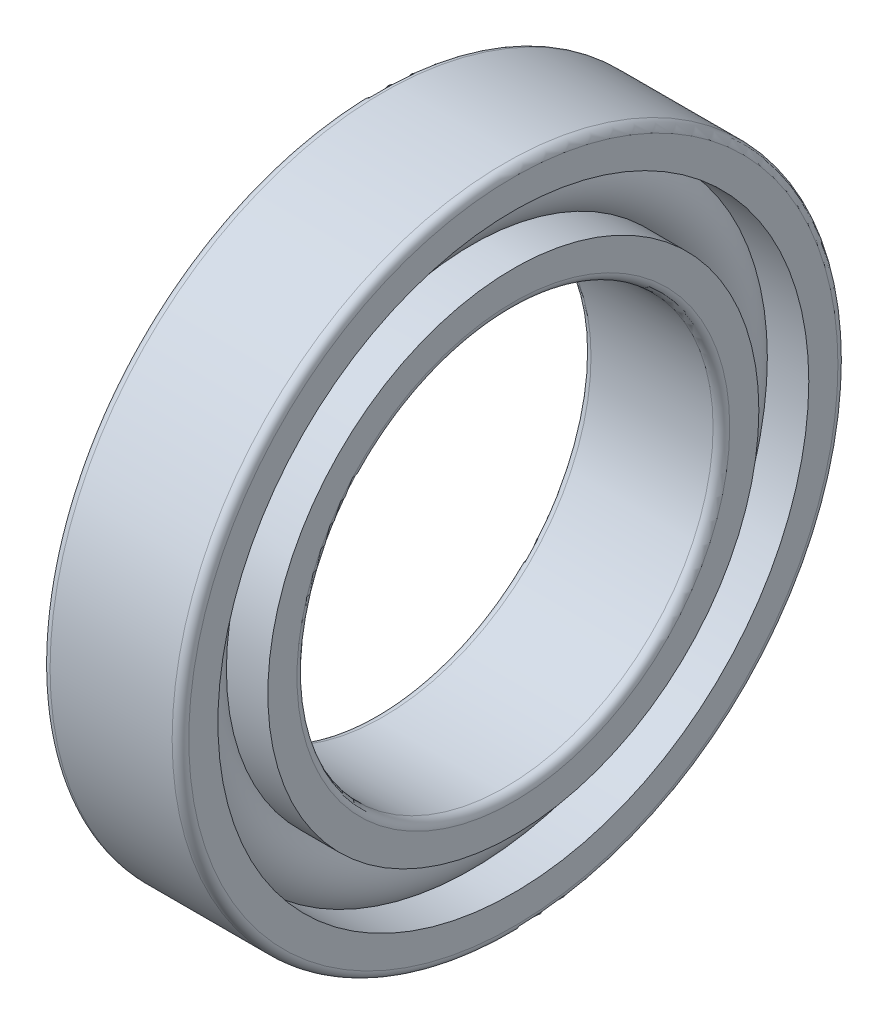
ISO-10303-21;
HEADER;
FILE_DESCRIPTION(('STEP AP214'),'2;1');
FILE_NAME('part.step','',(''),(''),'','','');
FILE_SCHEMA(('AUTOMOTIVE_DESIGN { 1 0 10303 214 1 1 1 1 }'));
ENDSEC;
DATA;
#1=APPLICATION_CONTEXT('core data for automotive mechanical design processes');
#2=APPLICATION_PROTOCOL_DEFINITION('international standard','automotive_design',2000,#1);
#3=PRODUCT_CONTEXT('',#1,'mechanical');
#4=PRODUCT('Part','Part','',(#3));
#5=PRODUCT_RELATED_PRODUCT_CATEGORY('part','',(#4));
#6=PRODUCT_DEFINITION_FORMATION('','',#4);
#7=PRODUCT_DEFINITION_CONTEXT('part definition',#1,'design');
#8=PRODUCT_DEFINITION('design','',#6,#7);
#9=PRODUCT_DEFINITION_SHAPE('','',#8);
#10=(LENGTH_UNIT() NAMED_UNIT(*) SI_UNIT(.MILLI.,.METRE.));
#11=(NAMED_UNIT(*) PLANE_ANGLE_UNIT() SI_UNIT($,.RADIAN.));
#12=(NAMED_UNIT(*) SI_UNIT($,.STERADIAN.) SOLID_ANGLE_UNIT());
#13=UNCERTAINTY_MEASURE_WITH_UNIT(LENGTH_MEASURE(1.E-05),#10,'distance_accuracy_value','');
#14=(GEOMETRIC_REPRESENTATION_CONTEXT(3) GLOBAL_UNCERTAINTY_ASSIGNED_CONTEXT((#13)) GLOBAL_UNIT_ASSIGNED_CONTEXT((#10,
#11,#12)) REPRESENTATION_CONTEXT('',''));
#15=CARTESIAN_POINT('',(0.,0.,0.));
#16=DIRECTION('',(0.,0.,1.));
#17=DIRECTION('',(1.,0.,0.));
#18=AXIS2_PLACEMENT_3D('',#15,#16,#17);
#19=CARTESIAN_POINT('',(0.,0.,0.));
#20=DIRECTION('',(-1.,0.,0.));
#21=DIRECTION('',(0.,0.,1.));
#22=AXIS2_PLACEMENT_3D('',#19,#20,#21);
#23=TOROIDAL_SURFACE('',#22,9.75,1.35);
#24=CARTESIAN_POINT('',(1.0062305898749,0.,0.));
#25=DIRECTION('',(-1.,0.,0.));
#26=DIRECTION('',(0.,0.,1.));
#27=AXIS2_PLACEMENT_3D('',#24,#25,#26);
#28=CIRCLE('',#27,10.65);
#29=CARTESIAN_POINT('',(1.0062305898749,0.,10.65));
#30=VERTEX_POINT('',#29);
#31=EDGE_CURVE('E34',#30,#30,#28,.F.);
#32=ORIENTED_EDGE('',*,*,#31,.T.);
#33=EDGE_LOOP('',(#32));
#34=FACE_BOUND('',#33,.T.);
#35=CARTESIAN_POINT('',(1.00623058987491,0.,0.));
#36=DIRECTION('',(-1.,0.,0.));
#37=DIRECTION('',(0.,0.,1.));
#38=AXIS2_PLACEMENT_3D('',#35,#36,#37);
#39=CIRCLE('',#38,8.85);
#40=CARTESIAN_POINT('',(1.00623058987491,0.,8.85));
#41=VERTEX_POINT('',#40);
#42=EDGE_CURVE('E10',#41,#41,#39,.T.);
#43=ORIENTED_EDGE('',*,*,#42,.T.);
#44=EDGE_LOOP('',(#43));
#45=FACE_BOUND('',#44,.T.);
#46=ADVANCED_FACE('F30',(#34,#45),#23,.T.);
#47=CARTESIAN_POINT('',(-20.6375,0.,0.));
#48=DIRECTION('',(1.,0.,0.));
#49=DIRECTION('',(0.,0.,-1.));
#50=AXIS2_PLACEMENT_3D('',#47,#48,#49);
#51=CYLINDRICAL_SURFACE('',#50,8.85);
#52=CARTESIAN_POINT('',(2.5,0.,0.));
#53=DIRECTION('',(1.,0.,0.));
#54=DIRECTION('',(0.,0.,-1.));
#55=AXIS2_PLACEMENT_3D('',#52,#53,#54);
#56=CIRCLE('',#55,8.85);
#57=CARTESIAN_POINT('',(2.5,0.,-8.85));
#58=VERTEX_POINT('',#57);
#59=EDGE_CURVE('E43',#58,#58,#56,.T.);
#60=ORIENTED_EDGE('',*,*,#59,.F.);
#61=EDGE_LOOP('',(#60));
#62=FACE_BOUND('',#61,.T.);
#63=ORIENTED_EDGE('',*,*,#42,.F.);
#64=EDGE_LOOP('',(#63));
#65=FACE_BOUND('',#64,.T.);
#66=ADVANCED_FACE('F82',(#62,#65),#51,.T.);
#67=CARTESIAN_POINT('',(-20.6375,0.,0.));
#68=DIRECTION('',(1.,0.,0.));
#69=DIRECTION('',(0.,0.,-1.));
#70=AXIS2_PLACEMENT_3D('',#67,#68,#69);
#71=CYLINDRICAL_SURFACE('',#70,8.85);
#72=CARTESIAN_POINT('',(-2.5,0.,0.));
#73=DIRECTION('',(1.,0.,0.));
#74=DIRECTION('',(0.,0.,-1.));
#75=AXIS2_PLACEMENT_3D('',#72,#73,#74);
#76=CIRCLE('',#75,8.85);
#77=CARTESIAN_POINT('',(-2.5,0.,-8.85));
#78=VERTEX_POINT('',#77);
#79=EDGE_CURVE('E52',#78,#78,#76,.T.);
#80=ORIENTED_EDGE('',*,*,#79,.T.);
#81=EDGE_LOOP('',(#80));
#82=FACE_BOUND('',#81,.T.);
#83=CARTESIAN_POINT('',(-1.00623058987491,0.,0.));
#84=DIRECTION('',(1.,0.,0.));
#85=DIRECTION('',(0.,0.,-1.));
#86=AXIS2_PLACEMENT_3D('',#83,#84,#85);
#87=CIRCLE('',#86,8.85);
#88=CARTESIAN_POINT('',(-1.00623058987491,0.,-8.85));
#89=VERTEX_POINT('',#88);
#90=EDGE_CURVE('E38',#89,#89,#87,.T.);
#91=ORIENTED_EDGE('',*,*,#90,.F.);
#92=EDGE_LOOP('',(#91));
#93=FACE_BOUND('',#92,.T.);
#94=ADVANCED_FACE('F85',(#82,#93),#71,.T.);
#95=CARTESIAN_POINT('',(2.5,7.8,0.));
#96=DIRECTION('',(1.,0.,0.));
#97=DIRECTION('',(0.,0.,-1.));
#98=AXIS2_PLACEMENT_3D('',#95,#96,#97);
#99=PLANE('',#98);
#100=ORIENTED_EDGE('',*,*,#59,.T.);
#101=EDGE_LOOP('',(#100));
#102=FACE_BOUND('',#101,.T.);
#103=CARTESIAN_POINT('',(2.5,0.,0.));
#104=DIRECTION('',(1.,0.,0.));
#105=DIRECTION('',(0.,0.,-1.));
#106=AXIS2_PLACEMENT_3D('',#103,#104,#105);
#107=CIRCLE('',#106,7.8);
#108=CARTESIAN_POINT('',(2.5,0.,-7.8));
#109=VERTEX_POINT('',#108);
#110=EDGE_CURVE('E74',#109,#109,#107,.T.);
#111=ORIENTED_EDGE('',*,*,#110,.F.);
#112=EDGE_LOOP('',(#111));
#113=FACE_BOUND('',#112,.T.);
#114=ADVANCED_FACE('F79',(#102,#113),#99,.T.);
#115=CARTESIAN_POINT('',(2.2,0.,0.));
#116=DIRECTION('',(1.,0.,0.));
#117=DIRECTION('',(0.,0.,-1.));
#118=AXIS2_PLACEMENT_3D('',#115,#116,#117);
#119=TOROIDAL_SURFACE('',#118,7.8,0.299999999999999);
#120=ORIENTED_EDGE('',*,*,#110,.T.);
#121=EDGE_LOOP('',(#120));
#122=FACE_BOUND('',#121,.T.);
#123=CARTESIAN_POINT('',(2.2,0.,0.));
#124=DIRECTION('',(1.,0.,0.));
#125=DIRECTION('',(0.,0.,-1.));
#126=AXIS2_PLACEMENT_3D('',#123,#124,#125);
#127=CIRCLE('',#126,7.5);
#128=CARTESIAN_POINT('',(2.2,0.,-7.5));
#129=VERTEX_POINT('',#128);
#130=EDGE_CURVE('E71',#129,#129,#127,.T.);
#131=ORIENTED_EDGE('',*,*,#130,.F.);
#132=EDGE_LOOP('',(#131));
#133=FACE_BOUND('',#132,.T.);
#134=ADVANCED_FACE('F96',(#122,#133),#119,.T.);
#135=CARTESIAN_POINT('',(-20.6375,0.,0.));
#136=DIRECTION('',(1.,0.,0.));
#137=DIRECTION('',(0.,0.,-1.));
#138=AXIS2_PLACEMENT_3D('',#135,#136,#137);
#139=CYLINDRICAL_SURFACE('',#138,7.5);
#140=ORIENTED_EDGE('',*,*,#130,.T.);
#141=EDGE_LOOP('',(#140));
#142=FACE_BOUND('',#141,.T.);
#143=CARTESIAN_POINT('',(-2.2,0.,0.));
#144=DIRECTION('',(1.,0.,0.));
#145=DIRECTION('',(0.,0.,-1.));
#146=AXIS2_PLACEMENT_3D('',#143,#144,#145);
#147=CIRCLE('',#146,7.5);
#148=CARTESIAN_POINT('',(-2.2,0.,-7.5));
#149=VERTEX_POINT('',#148);
#150=EDGE_CURVE('E68',#149,#149,#147,.T.);
#151=ORIENTED_EDGE('',*,*,#150,.F.);
#152=EDGE_LOOP('',(#151));
#153=FACE_BOUND('',#152,.T.);
#154=ADVANCED_FACE('F99',(#142,#153),#139,.F.);
#155=CARTESIAN_POINT('',(-2.2,0.,0.));
#156=DIRECTION('',(1.,0.,0.));
#157=DIRECTION('',(0.,0.,-1.));
#158=AXIS2_PLACEMENT_3D('',#155,#156,#157);
#159=TOROIDAL_SURFACE('',#158,7.8,0.299999999999999);
#160=ORIENTED_EDGE('',*,*,#150,.T.);
#161=EDGE_LOOP('',(#160));
#162=FACE_BOUND('',#161,.T.);
#163=CARTESIAN_POINT('',(-2.5,0.,0.));
#164=DIRECTION('',(1.,0.,0.));
#165=DIRECTION('',(0.,0.,-1.));
#166=AXIS2_PLACEMENT_3D('',#163,#164,#165);
#167=CIRCLE('',#166,7.8);
#168=CARTESIAN_POINT('',(-2.5,0.,-7.8));
#169=VERTEX_POINT('',#168);
#170=EDGE_CURVE('E65',#169,#169,#167,.T.);
#171=ORIENTED_EDGE('',*,*,#170,.F.);
#172=EDGE_LOOP('',(#171));
#173=FACE_BOUND('',#172,.T.);
#174=ADVANCED_FACE('F103',(#162,#173),#159,.T.);
#175=CARTESIAN_POINT('',(-2.5,8.85,0.));
#176=DIRECTION('',(-1.,0.,0.));
#177=DIRECTION('',(0.,0.,1.));
#178=AXIS2_PLACEMENT_3D('',#175,#176,#177);
#179=PLANE('',#178);
#180=ORIENTED_EDGE('',*,*,#170,.T.);
#181=EDGE_LOOP('',(#180));
#182=FACE_BOUND('',#181,.T.);
#183=ORIENTED_EDGE('',*,*,#79,.F.);
#184=EDGE_LOOP('',(#183));
#185=FACE_BOUND('',#184,.T.);
#186=ADVANCED_FACE('F107',(#182,#185),#179,.T.);
#187=CARTESIAN_POINT('',(-1.0062305898749,0.,0.));
#188=DIRECTION('',(1.,0.,0.));
#189=DIRECTION('',(0.,0.,-1.));
#190=AXIS2_PLACEMENT_3D('',#187,#188,#189);
#191=CIRCLE('',#190,10.65);
#192=CARTESIAN_POINT('',(-1.0062305898749,0.,-10.65));
#193=VERTEX_POINT('',#192);
#194=EDGE_CURVE('E46',#193,#193,#191,.F.);
#195=ORIENTED_EDGE('',*,*,#194,.T.);
#196=EDGE_LOOP('',(#195));
#197=FACE_BOUND('',#196,.T.);
#198=ORIENTED_EDGE('',*,*,#90,.T.);
#199=EDGE_LOOP('',(#198));
#200=FACE_BOUND('',#199,.T.);
#201=ADVANCED_FACE('F32',(#197,#200),#23,.T.);
#202=CARTESIAN_POINT('',(-20.6375,0.,0.));
#203=DIRECTION('',(1.,0.,0.));
#204=DIRECTION('',(0.,0.,-1.));
#205=AXIS2_PLACEMENT_3D('',#202,#203,#204);
#206=CYLINDRICAL_SURFACE('',#205,10.65);
#207=CARTESIAN_POINT('',(2.5,0.,0.));
#208=DIRECTION('',(1.,0.,0.));
#209=DIRECTION('',(0.,0.,-1.));
#210=AXIS2_PLACEMENT_3D('',#207,#208,#209);
#211=CIRCLE('',#210,10.65);
#212=CARTESIAN_POINT('',(2.5,0.,-10.65));
#213=VERTEX_POINT('',#212);
#214=EDGE_CURVE('E48',#213,#213,#211,.T.);
#215=ORIENTED_EDGE('',*,*,#214,.T.);
#216=EDGE_LOOP('',(#215));
#217=FACE_BOUND('',#216,.T.);
#218=ORIENTED_EDGE('',*,*,#31,.F.);
#219=EDGE_LOOP('',(#218));
#220=FACE_BOUND('',#219,.T.);
#221=ADVANCED_FACE('F112',(#217,#220),#206,.F.);
#222=CARTESIAN_POINT('',(-20.6375,0.,0.));
#223=DIRECTION('',(1.,0.,0.));
#224=DIRECTION('',(0.,0.,-1.));
#225=AXIS2_PLACEMENT_3D('',#222,#223,#224);
#226=CYLINDRICAL_SURFACE('',#225,10.65);
#227=CARTESIAN_POINT('',(-2.5,0.,0.));
#228=DIRECTION('',(1.,0.,0.));
#229=DIRECTION('',(0.,0.,-1.));
#230=AXIS2_PLACEMENT_3D('',#227,#228,#229);
#231=CIRCLE('',#230,10.65);
#232=CARTESIAN_POINT('',(-2.5,0.,-10.65));
#233=VERTEX_POINT('',#232);
#234=EDGE_CURVE('E143',#233,#233,#231,.T.);
#235=ORIENTED_EDGE('',*,*,#234,.F.);
#236=EDGE_LOOP('',(#235));
#237=FACE_BOUND('',#236,.T.);
#238=ORIENTED_EDGE('',*,*,#194,.F.);
#239=EDGE_LOOP('',(#238));
#240=FACE_BOUND('',#239,.T.);
#241=ADVANCED_FACE('F115',(#237,#240),#226,.F.);
#242=CARTESIAN_POINT('',(2.5,11.7,0.));
#243=DIRECTION('',(1.,0.,0.));
#244=DIRECTION('',(0.,0.,-1.));
#245=AXIS2_PLACEMENT_3D('',#242,#243,#244);
#246=PLANE('',#245);
#247=CARTESIAN_POINT('',(2.5,0.,0.));
#248=DIRECTION('',(1.,0.,0.));
#249=DIRECTION('',(0.,0.,-1.));
#250=AXIS2_PLACEMENT_3D('',#247,#248,#249);
#251=CIRCLE('',#250,11.7);
#252=CARTESIAN_POINT('',(2.5,0.,-11.7));
#253=VERTEX_POINT('',#252);
#254=EDGE_CURVE('E54',#253,#253,#251,.T.);
#255=ORIENTED_EDGE('',*,*,#254,.T.);
#256=EDGE_LOOP('',(#255));
#257=FACE_BOUND('',#256,.T.);
#258=ORIENTED_EDGE('',*,*,#214,.F.);
#259=EDGE_LOOP('',(#258));
#260=FACE_BOUND('',#259,.T.);
#261=ADVANCED_FACE('F116',(#257,#260),#246,.T.);
#262=CARTESIAN_POINT('',(2.2,0.,0.));
#263=DIRECTION('',(1.,0.,0.));
#264=DIRECTION('',(0.,0.,-1.));
#265=AXIS2_PLACEMENT_3D('',#262,#263,#264);
#266=TOROIDAL_SURFACE('',#265,11.7,0.3);
#267=CARTESIAN_POINT('',(2.2,0.,0.));
#268=DIRECTION('',(1.,0.,0.));
#269=DIRECTION('',(0.,0.,-1.));
#270=AXIS2_PLACEMENT_3D('',#267,#268,#269);
#271=CIRCLE('',#270,12.);
#272=CARTESIAN_POINT('',(2.2,0.,-12.));
#273=VERTEX_POINT('',#272);
#274=EDGE_CURVE('E59',#273,#273,#271,.T.);
#275=ORIENTED_EDGE('',*,*,#274,.T.);
#276=EDGE_LOOP('',(#275));
#277=FACE_BOUND('',#276,.T.);
#278=ORIENTED_EDGE('',*,*,#254,.F.);
#279=EDGE_LOOP('',(#278));
#280=FACE_BOUND('',#279,.T.);
#281=ADVANCED_FACE('F119',(#277,#280),#266,.T.);
#282=CARTESIAN_POINT('',(-20.6375,0.,0.));
#283=DIRECTION('',(1.,0.,0.));
#284=DIRECTION('',(0.,0.,-1.));
#285=AXIS2_PLACEMENT_3D('',#282,#283,#284);
#286=CYLINDRICAL_SURFACE('',#285,12.);
#287=CARTESIAN_POINT('',(-2.2,0.,0.));
#288=DIRECTION('',(1.,0.,0.));
#289=DIRECTION('',(0.,0.,-1.));
#290=AXIS2_PLACEMENT_3D('',#287,#288,#289);
#291=CIRCLE('',#290,12.);
#292=CARTESIAN_POINT('',(-2.2,0.,-12.));
#293=VERTEX_POINT('',#292);
#294=EDGE_CURVE('E147',#293,#293,#291,.T.);
#295=ORIENTED_EDGE('',*,*,#294,.T.);
#296=EDGE_LOOP('',(#295));
#297=FACE_BOUND('',#296,.T.);
#298=ORIENTED_EDGE('',*,*,#274,.F.);
#299=EDGE_LOOP('',(#298));
#300=FACE_BOUND('',#299,.T.);
#301=ADVANCED_FACE('F123',(#297,#300),#286,.T.);
#302=CARTESIAN_POINT('',(-2.2,0.,0.));
#303=DIRECTION('',(1.,0.,0.));
#304=DIRECTION('',(0.,0.,-1.));
#305=AXIS2_PLACEMENT_3D('',#302,#303,#304);
#306=TOROIDAL_SURFACE('',#305,11.7,0.3);
#307=CARTESIAN_POINT('',(-2.5,0.,0.));
#308=DIRECTION('',(1.,0.,0.));
#309=DIRECTION('',(0.,0.,-1.));
#310=AXIS2_PLACEMENT_3D('',#307,#308,#309);
#311=CIRCLE('',#310,11.7);
#312=CARTESIAN_POINT('',(-2.5,0.,-11.7));
#313=VERTEX_POINT('',#312);
#314=EDGE_CURVE('E144',#313,#313,#311,.T.);
#315=ORIENTED_EDGE('',*,*,#314,.T.);
#316=EDGE_LOOP('',(#315));
#317=FACE_BOUND('',#316,.T.);
#318=ORIENTED_EDGE('',*,*,#294,.F.);
#319=EDGE_LOOP('',(#318));
#320=FACE_BOUND('',#319,.T.);
#321=ADVANCED_FACE('F127',(#317,#320),#306,.T.);
#322=CARTESIAN_POINT('',(-2.5,10.65,0.));
#323=DIRECTION('',(-1.,0.,0.));
#324=DIRECTION('',(0.,0.,1.));
#325=AXIS2_PLACEMENT_3D('',#322,#323,#324);
#326=PLANE('',#325);
#327=ORIENTED_EDGE('',*,*,#234,.T.);
#328=EDGE_LOOP('',(#327));
#329=FACE_BOUND('',#328,.T.);
#330=ORIENTED_EDGE('',*,*,#314,.F.);
#331=EDGE_LOOP('',(#330));
#332=FACE_BOUND('',#331,.T.);
#333=ADVANCED_FACE('F131',(#329,#332),#326,.T.);
#334=CLOSED_SHELL('',(#46,#66,#94,#114,#134,#154,#174,#186,#201,#221,#241,#261,#281,#301,#321,#333));
#335=MANIFOLD_SOLID_BREP('B2',#334);
#336=ADVANCED_BREP_SHAPE_REPRESENTATION('',(#18,#335),#14);
#337=SHAPE_DEFINITION_REPRESENTATION(#9,#336);
ENDSEC;
END-ISO-10303-21;
